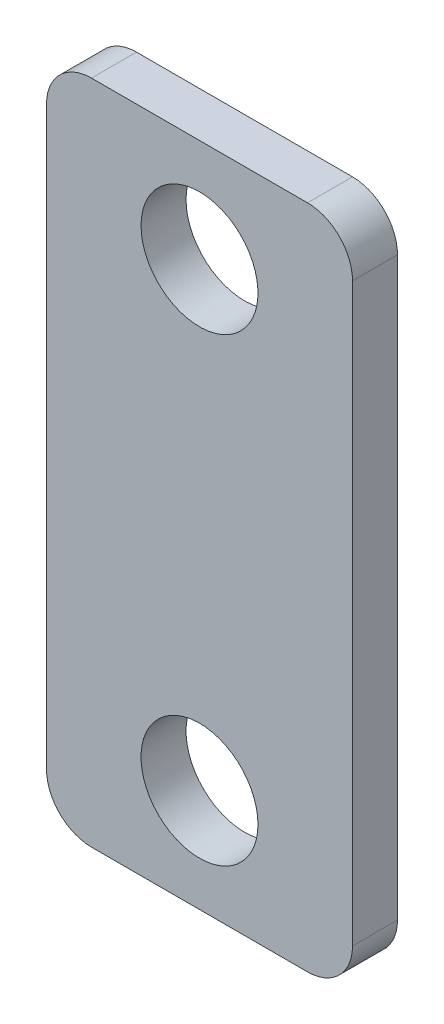
ISO-10303-21;
HEADER;
FILE_DESCRIPTION(('STEP AP214'),'2;1');
FILE_NAME('part.step','',(''),(''),'','','');
FILE_SCHEMA(('AUTOMOTIVE_DESIGN { 1 0 10303 214 1 1 1 1 }'));
ENDSEC;
DATA;
#1=APPLICATION_CONTEXT('core data for automotive mechanical design processes');
#2=APPLICATION_PROTOCOL_DEFINITION('international standard','automotive_design',2000,#1);
#3=PRODUCT_CONTEXT('',#1,'mechanical');
#4=PRODUCT('Part','Part','',(#3));
#5=PRODUCT_RELATED_PRODUCT_CATEGORY('part','',(#4));
#6=PRODUCT_DEFINITION_FORMATION('','',#4);
#7=PRODUCT_DEFINITION_CONTEXT('part definition',#1,'design');
#8=PRODUCT_DEFINITION('design','',#6,#7);
#9=PRODUCT_DEFINITION_SHAPE('','',#8);
#10=(LENGTH_UNIT() NAMED_UNIT(*) SI_UNIT(.MILLI.,.METRE.));
#11=(NAMED_UNIT(*) PLANE_ANGLE_UNIT() SI_UNIT($,.RADIAN.));
#12=(NAMED_UNIT(*) SI_UNIT($,.STERADIAN.) SOLID_ANGLE_UNIT());
#13=UNCERTAINTY_MEASURE_WITH_UNIT(LENGTH_MEASURE(1.E-05),#10,'distance_accuracy_value','');
#14=(GEOMETRIC_REPRESENTATION_CONTEXT(3) GLOBAL_UNCERTAINTY_ASSIGNED_CONTEXT((#13)) GLOBAL_UNIT_ASSIGNED_CONTEXT((#10,
#11,#12)) REPRESENTATION_CONTEXT('',''));
#15=CARTESIAN_POINT('',(0.,0.,0.));
#16=DIRECTION('',(0.,0.,1.));
#17=DIRECTION('',(1.,0.,0.));
#18=AXIS2_PLACEMENT_3D('',#15,#16,#17);
#19=CARTESIAN_POINT('',(0.,0.,3.175));
#20=DIRECTION('',(0.,0.,-1.));
#21=DIRECTION('',(-1.,0.,0.));
#22=AXIS2_PLACEMENT_3D('',#19,#20,#21);
#23=PLANE('',#22);
#24=CARTESIAN_POINT('',(10.795,39.7298015993552,3.175));
#25=DIRECTION('',(0.,0.,-1.));
#26=DIRECTION('',(-1.,0.,0.));
#27=AXIS2_PLACEMENT_3D('',#24,#25,#26);
#28=CIRCLE('',#27,4.124999878);
#29=CARTESIAN_POINT('',(6.670000122,39.7298015993552,3.175));
#30=VERTEX_POINT('',#29);
#31=EDGE_CURVE('E265',#30,#30,#28,.T.);
#32=ORIENTED_EDGE('',*,*,#31,.T.);
#33=EDGE_LOOP('',(#32));
#34=FACE_BOUND('',#33,.T.);
#35=DIRECTION('',(0.,1.,0.));
#36=VECTOR('',#35,1.);
#37=CARTESIAN_POINT('',(21.59,0.,3.175));
#38=LINE('',#37,#36);
#39=CARTESIAN_POINT('',(21.59,3.175,3.175));
#40=VERTEX_POINT('',#39);
#41=CARTESIAN_POINT('',(21.59,43.815,3.175));
#42=VERTEX_POINT('',#41);
#43=EDGE_CURVE('E170',#40,#42,#38,.T.);
#44=ORIENTED_EDGE('',*,*,#43,.T.);
#45=CARTESIAN_POINT('',(18.415,43.815,3.175));
#46=DIRECTION('',(0.,0.,-1.));
#47=DIRECTION('',(-1.,0.,0.));
#48=AXIS2_PLACEMENT_3D('',#45,#46,#47);
#49=CIRCLE('',#48,3.175);
#50=CARTESIAN_POINT('',(18.415,46.99,3.175));
#51=VERTEX_POINT('',#50);
#52=EDGE_CURVE('E188',#42,#51,#49,.F.);
#53=ORIENTED_EDGE('',*,*,#52,.T.);
#54=DIRECTION('',(1.,0.,0.));
#55=VECTOR('',#54,1.);
#56=CARTESIAN_POINT('',(0.,46.99,3.175));
#57=LINE('',#56,#55);
#58=CARTESIAN_POINT('',(3.175,46.99,3.175));
#59=VERTEX_POINT('',#58);
#60=EDGE_CURVE('E198',#59,#51,#57,.T.);
#61=ORIENTED_EDGE('',*,*,#60,.F.);
#62=CARTESIAN_POINT('',(3.175,43.815,3.175));
#63=DIRECTION('',(0.,0.,-1.));
#64=DIRECTION('',(-1.,0.,0.));
#65=AXIS2_PLACEMENT_3D('',#62,#63,#64);
#66=CIRCLE('',#65,3.175);
#67=CARTESIAN_POINT('',(0.,43.815,3.175));
#68=VERTEX_POINT('',#67);
#69=EDGE_CURVE('E165',#59,#68,#66,.F.);
#70=ORIENTED_EDGE('',*,*,#69,.T.);
#71=DIRECTION('',(0.,1.,0.));
#72=VECTOR('',#71,1.);
#73=CARTESIAN_POINT('',(0.,0.,3.175));
#74=LINE('',#73,#72);
#75=CARTESIAN_POINT('',(0.,3.175,3.175));
#76=VERTEX_POINT('',#75);
#77=EDGE_CURVE('E197',#76,#68,#74,.T.);
#78=ORIENTED_EDGE('',*,*,#77,.F.);
#79=CARTESIAN_POINT('',(3.175,3.175,3.175));
#80=DIRECTION('',(0.,0.,-1.));
#81=DIRECTION('',(-1.,0.,0.));
#82=AXIS2_PLACEMENT_3D('',#79,#80,#81);
#83=CIRCLE('',#82,3.175);
#84=CARTESIAN_POINT('',(3.175,0.,3.175));
#85=VERTEX_POINT('',#84);
#86=EDGE_CURVE('E94',#76,#85,#83,.F.);
#87=ORIENTED_EDGE('',*,*,#86,.T.);
#88=DIRECTION('',(1.,0.,0.));
#89=VECTOR('',#88,1.);
#90=CARTESIAN_POINT('',(0.,0.,3.175));
#91=LINE('',#90,#89);
#92=CARTESIAN_POINT('',(18.415,0.,3.175));
#93=VERTEX_POINT('',#92);
#94=EDGE_CURVE('E166',#85,#93,#91,.T.);
#95=ORIENTED_EDGE('',*,*,#94,.T.);
#96=CARTESIAN_POINT('',(18.415,3.175,3.175));
#97=DIRECTION('',(0.,0.,-1.));
#98=DIRECTION('',(-1.,0.,0.));
#99=AXIS2_PLACEMENT_3D('',#96,#97,#98);
#100=CIRCLE('',#99,3.175);
#101=EDGE_CURVE('E184',#93,#40,#100,.F.);
#102=ORIENTED_EDGE('',*,*,#101,.T.);
#103=EDGE_LOOP('',(#44,#53,#61,#70,#78,#87,#95,#102));
#104=FACE_BOUND('',#103,.T.);
#105=CARTESIAN_POINT('',(10.795,7.26019840064482,3.175));
#106=DIRECTION('',(0.,0.,1.));
#107=DIRECTION('',(1.,0.,0.));
#108=AXIS2_PLACEMENT_3D('',#105,#106,#107);
#109=CIRCLE('',#108,4.124999878);
#110=CARTESIAN_POINT('',(14.919999878,7.26019840064482,3.175));
#111=VERTEX_POINT('',#110);
#112=EDGE_CURVE('E207',#111,#111,#109,.T.);
#113=ORIENTED_EDGE('',*,*,#112,.F.);
#114=EDGE_LOOP('',(#113));
#115=FACE_BOUND('',#114,.T.);
#116=ADVANCED_FACE('F73',(#34,#104,#115),#23,.F.);
#117=CARTESIAN_POINT('',(0.,0.,0.));
#118=DIRECTION('',(0.,0.,-1.));
#119=DIRECTION('',(-1.,0.,0.));
#120=AXIS2_PLACEMENT_3D('',#117,#118,#119);
#121=PLANE('',#120);
#122=CARTESIAN_POINT('',(10.795,39.7298015993552,0.));
#123=DIRECTION('',(0.,0.,-1.));
#124=DIRECTION('',(-1.,0.,0.));
#125=AXIS2_PLACEMENT_3D('',#122,#123,#124);
#126=CIRCLE('',#125,4.124999878);
#127=CARTESIAN_POINT('',(6.670000122,39.7298015993552,0.));
#128=VERTEX_POINT('',#127);
#129=EDGE_CURVE('E268',#128,#128,#126,.T.);
#130=ORIENTED_EDGE('',*,*,#129,.F.);
#131=EDGE_LOOP('',(#130));
#132=FACE_BOUND('',#131,.T.);
#133=DIRECTION('',(1.,0.,0.));
#134=VECTOR('',#133,1.);
#135=CARTESIAN_POINT('',(0.,46.99,0.));
#136=LINE('',#135,#134);
#137=CARTESIAN_POINT('',(3.175,46.99,0.));
#138=VERTEX_POINT('',#137);
#139=CARTESIAN_POINT('',(18.415,46.99,0.));
#140=VERTEX_POINT('',#139);
#141=EDGE_CURVE('E143',#138,#140,#136,.T.);
#142=ORIENTED_EDGE('',*,*,#141,.T.);
#143=CARTESIAN_POINT('',(18.415,43.815,0.));
#144=DIRECTION('',(0.,0.,-1.));
#145=DIRECTION('',(-1.,0.,0.));
#146=AXIS2_PLACEMENT_3D('',#143,#144,#145);
#147=CIRCLE('',#146,3.175);
#148=CARTESIAN_POINT('',(21.59,43.815,0.));
#149=VERTEX_POINT('',#148);
#150=EDGE_CURVE('E150',#140,#149,#147,.T.);
#151=ORIENTED_EDGE('',*,*,#150,.T.);
#152=DIRECTION('',(0.,1.,0.));
#153=VECTOR('',#152,1.);
#154=CARTESIAN_POINT('',(21.59,0.,0.));
#155=LINE('',#154,#153);
#156=CARTESIAN_POINT('',(21.59,3.175,0.));
#157=VERTEX_POINT('',#156);
#158=EDGE_CURVE('E161',#157,#149,#155,.T.);
#159=ORIENTED_EDGE('',*,*,#158,.F.);
#160=CARTESIAN_POINT('',(18.415,3.175,0.));
#161=DIRECTION('',(0.,0.,-1.));
#162=DIRECTION('',(-1.,0.,0.));
#163=AXIS2_PLACEMENT_3D('',#160,#161,#162);
#164=CIRCLE('',#163,3.175);
#165=CARTESIAN_POINT('',(18.415,0.,0.));
#166=VERTEX_POINT('',#165);
#167=EDGE_CURVE('E168',#157,#166,#164,.T.);
#168=ORIENTED_EDGE('',*,*,#167,.T.);
#169=DIRECTION('',(1.,0.,0.));
#170=VECTOR('',#169,1.);
#171=CARTESIAN_POINT('',(0.,0.,0.));
#172=LINE('',#171,#170);
#173=CARTESIAN_POINT('',(3.175,0.,0.));
#174=VERTEX_POINT('',#173);
#175=EDGE_CURVE('E173',#174,#166,#172,.T.);
#176=ORIENTED_EDGE('',*,*,#175,.F.);
#177=CARTESIAN_POINT('',(3.175,3.175,0.));
#178=DIRECTION('',(0.,0.,-1.));
#179=DIRECTION('',(-1.,0.,0.));
#180=AXIS2_PLACEMENT_3D('',#177,#178,#179);
#181=CIRCLE('',#180,3.175);
#182=CARTESIAN_POINT('',(0.,3.175,0.));
#183=VERTEX_POINT('',#182);
#184=EDGE_CURVE('E151',#174,#183,#181,.T.);
#185=ORIENTED_EDGE('',*,*,#184,.T.);
#186=DIRECTION('',(0.,1.,0.));
#187=VECTOR('',#186,1.);
#188=CARTESIAN_POINT('',(0.,0.,0.));
#189=LINE('',#188,#187);
#190=CARTESIAN_POINT('',(0.,43.815,0.));
#191=VERTEX_POINT('',#190);
#192=EDGE_CURVE('E145',#183,#191,#189,.T.);
#193=ORIENTED_EDGE('',*,*,#192,.T.);
#194=CARTESIAN_POINT('',(3.175,43.815,0.));
#195=DIRECTION('',(0.,0.,-1.));
#196=DIRECTION('',(-1.,0.,0.));
#197=AXIS2_PLACEMENT_3D('',#194,#195,#196);
#198=CIRCLE('',#197,3.175);
#199=EDGE_CURVE('E139',#191,#138,#198,.T.);
#200=ORIENTED_EDGE('',*,*,#199,.T.);
#201=EDGE_LOOP('',(#142,#151,#159,#168,#176,#185,#193,#200));
#202=FACE_BOUND('',#201,.T.);
#203=CARTESIAN_POINT('',(10.795,7.26019840064482,0.));
#204=DIRECTION('',(0.,0.,1.));
#205=DIRECTION('',(1.,0.,0.));
#206=AXIS2_PLACEMENT_3D('',#203,#204,#205);
#207=CIRCLE('',#206,4.124999878);
#208=CARTESIAN_POINT('',(14.919999878,7.26019840064482,0.));
#209=VERTEX_POINT('',#208);
#210=EDGE_CURVE('E202',#209,#209,#207,.T.);
#211=ORIENTED_EDGE('',*,*,#210,.T.);
#212=EDGE_LOOP('',(#211));
#213=FACE_BOUND('',#212,.T.);
#214=ADVANCED_FACE('F141',(#132,#202,#213),#121,.T.);
#215=CARTESIAN_POINT('',(0.,0.,3.175));
#216=DIRECTION('',(-1.,0.,0.));
#217=DIRECTION('',(0.,0.,1.));
#218=AXIS2_PLACEMENT_3D('',#215,#216,#217);
#219=PLANE('',#218);
#220=ORIENTED_EDGE('',*,*,#77,.T.);
#221=DIRECTION('',(0.,0.,-1.));
#222=VECTOR('',#221,1.);
#223=CARTESIAN_POINT('',(0.,43.815,3.175));
#224=LINE('',#223,#222);
#225=EDGE_CURVE('E192',#68,#191,#224,.T.);
#226=ORIENTED_EDGE('',*,*,#225,.T.);
#227=ORIENTED_EDGE('',*,*,#192,.F.);
#228=DIRECTION('',(0.,0.,-1.));
#229=VECTOR('',#228,1.);
#230=CARTESIAN_POINT('',(0.,3.175,3.175));
#231=LINE('',#230,#229);
#232=EDGE_CURVE('E190',#183,#76,#231,.F.);
#233=ORIENTED_EDGE('',*,*,#232,.T.);
#234=EDGE_LOOP('',(#220,#226,#227,#233));
#235=FACE_BOUND('',#234,.T.);
#236=ADVANCED_FACE('F195',(#235),#219,.T.);
#237=CARTESIAN_POINT('',(0.,0.,3.175));
#238=DIRECTION('',(0.,1.,0.));
#239=DIRECTION('',(0.,0.,1.));
#240=AXIS2_PLACEMENT_3D('',#237,#238,#239);
#241=PLANE('',#240);
#242=ORIENTED_EDGE('',*,*,#94,.F.);
#243=DIRECTION('',(0.,0.,-1.));
#244=VECTOR('',#243,1.);
#245=CARTESIAN_POINT('',(3.175,0.,0.));
#246=LINE('',#245,#244);
#247=EDGE_CURVE('E12',#85,#174,#246,.T.);
#248=ORIENTED_EDGE('',*,*,#247,.T.);
#249=ORIENTED_EDGE('',*,*,#175,.T.);
#250=DIRECTION('',(0.,0.,-1.));
#251=VECTOR('',#250,1.);
#252=CARTESIAN_POINT('',(18.415,0.,3.175));
#253=LINE('',#252,#251);
#254=EDGE_CURVE('E81',#166,#93,#253,.F.);
#255=ORIENTED_EDGE('',*,*,#254,.T.);
#256=EDGE_LOOP('',(#242,#248,#249,#255));
#257=FACE_BOUND('',#256,.T.);
#258=ADVANCED_FACE('F222',(#257),#241,.F.);
#259=CARTESIAN_POINT('',(21.59,0.,3.175));
#260=DIRECTION('',(-1.,0.,0.));
#261=DIRECTION('',(0.,0.,1.));
#262=AXIS2_PLACEMENT_3D('',#259,#260,#261);
#263=PLANE('',#262);
#264=ORIENTED_EDGE('',*,*,#158,.T.);
#265=DIRECTION('',(0.,0.,-1.));
#266=VECTOR('',#265,1.);
#267=CARTESIAN_POINT('',(21.59,43.815,3.175));
#268=LINE('',#267,#266);
#269=EDGE_CURVE('E182',#149,#42,#268,.F.);
#270=ORIENTED_EDGE('',*,*,#269,.T.);
#271=ORIENTED_EDGE('',*,*,#43,.F.);
#272=DIRECTION('',(0.,0.,-1.));
#273=VECTOR('',#272,1.);
#274=CARTESIAN_POINT('',(21.59,3.175,3.175));
#275=LINE('',#274,#273);
#276=EDGE_CURVE('E179',#40,#157,#275,.T.);
#277=ORIENTED_EDGE('',*,*,#276,.T.);
#278=EDGE_LOOP('',(#264,#270,#271,#277));
#279=FACE_BOUND('',#278,.T.);
#280=ADVANCED_FACE('F212',(#279),#263,.F.);
#281=CARTESIAN_POINT('',(0.,46.99,3.175));
#282=DIRECTION('',(0.,1.,0.));
#283=DIRECTION('',(0.,0.,1.));
#284=AXIS2_PLACEMENT_3D('',#281,#282,#283);
#285=PLANE('',#284);
#286=ORIENTED_EDGE('',*,*,#60,.T.);
#287=DIRECTION('',(0.,0.,-1.));
#288=VECTOR('',#287,1.);
#289=CARTESIAN_POINT('',(18.415,46.99,0.));
#290=LINE('',#289,#288);
#291=EDGE_CURVE('E160',#51,#140,#290,.T.);
#292=ORIENTED_EDGE('',*,*,#291,.T.);
#293=ORIENTED_EDGE('',*,*,#141,.F.);
#294=DIRECTION('',(0.,0.,-1.));
#295=VECTOR('',#294,1.);
#296=CARTESIAN_POINT('',(3.175,46.99,3.175));
#297=LINE('',#296,#295);
#298=EDGE_CURVE('E157',#138,#59,#297,.F.);
#299=ORIENTED_EDGE('',*,*,#298,.T.);
#300=EDGE_LOOP('',(#286,#292,#293,#299));
#301=FACE_BOUND('',#300,.T.);
#302=ADVANCED_FACE('F156',(#301),#285,.T.);
#303=CARTESIAN_POINT('',(10.795,7.26019840064482,3.175));
#304=DIRECTION('',(0.,0.,-1.));
#305=DIRECTION('',(-1.,0.,0.));
#306=AXIS2_PLACEMENT_3D('',#303,#304,#305);
#307=CYLINDRICAL_SURFACE('',#306,4.124999878);
#308=ORIENTED_EDGE('',*,*,#112,.T.);
#309=EDGE_LOOP('',(#308));
#310=FACE_BOUND('',#309,.T.);
#311=ORIENTED_EDGE('',*,*,#210,.F.);
#312=EDGE_LOOP('',(#311));
#313=FACE_BOUND('',#312,.T.);
#314=ADVANCED_FACE('F243',(#310,#313),#307,.F.);
#315=CARTESIAN_POINT('',(10.795,39.7298015993552,3.175));
#316=DIRECTION('',(0.,0.,-1.));
#317=DIRECTION('',(-1.,0.,0.));
#318=AXIS2_PLACEMENT_3D('',#315,#316,#317);
#319=CYLINDRICAL_SURFACE('',#318,4.124999878);
#320=ORIENTED_EDGE('',*,*,#31,.F.);
#321=EDGE_LOOP('',(#320));
#322=FACE_BOUND('',#321,.T.);
#323=ORIENTED_EDGE('',*,*,#129,.T.);
#324=EDGE_LOOP('',(#323));
#325=FACE_BOUND('',#324,.T.);
#326=ADVANCED_FACE('F255',(#322,#325),#319,.F.);
#327=CARTESIAN_POINT('',(18.415,43.815,3.175));
#328=DIRECTION('',(0.,0.,1.));
#329=DIRECTION('',(1.,0.,0.));
#330=AXIS2_PLACEMENT_3D('',#327,#328,#329);
#331=CYLINDRICAL_SURFACE('',#330,3.175);
#332=ORIENTED_EDGE('',*,*,#52,.F.);
#333=ORIENTED_EDGE('',*,*,#269,.F.);
#334=ORIENTED_EDGE('',*,*,#150,.F.);
#335=ORIENTED_EDGE('',*,*,#291,.F.);
#336=EDGE_LOOP('',(#332,#333,#334,#335));
#337=FACE_BOUND('',#336,.T.);
#338=ADVANCED_FACE('F217',(#337),#331,.T.);
#339=CARTESIAN_POINT('',(3.175,43.815,3.175));
#340=DIRECTION('',(0.,0.,-1.));
#341=DIRECTION('',(-1.,0.,0.));
#342=AXIS2_PLACEMENT_3D('',#339,#340,#341);
#343=CYLINDRICAL_SURFACE('',#342,3.175);
#344=ORIENTED_EDGE('',*,*,#69,.F.);
#345=ORIENTED_EDGE('',*,*,#298,.F.);
#346=ORIENTED_EDGE('',*,*,#199,.F.);
#347=ORIENTED_EDGE('',*,*,#225,.F.);
#348=EDGE_LOOP('',(#344,#345,#346,#347));
#349=FACE_BOUND('',#348,.T.);
#350=ADVANCED_FACE('F164',(#349),#343,.T.);
#351=CARTESIAN_POINT('',(3.175,3.175,3.175));
#352=DIRECTION('',(0.,0.,1.));
#353=DIRECTION('',(1.,0.,0.));
#354=AXIS2_PLACEMENT_3D('',#351,#352,#353);
#355=CYLINDRICAL_SURFACE('',#354,3.175);
#356=ORIENTED_EDGE('',*,*,#86,.F.);
#357=ORIENTED_EDGE('',*,*,#232,.F.);
#358=ORIENTED_EDGE('',*,*,#184,.F.);
#359=ORIENTED_EDGE('',*,*,#247,.F.);
#360=EDGE_LOOP('',(#356,#357,#358,#359));
#361=FACE_BOUND('',#360,.T.);
#362=ADVANCED_FACE('F225',(#361),#355,.T.);
#363=CARTESIAN_POINT('',(18.415,3.175,3.175));
#364=DIRECTION('',(0.,0.,-1.));
#365=DIRECTION('',(-1.,0.,0.));
#366=AXIS2_PLACEMENT_3D('',#363,#364,#365);
#367=CYLINDRICAL_SURFACE('',#366,3.175);
#368=ORIENTED_EDGE('',*,*,#101,.F.);
#369=ORIENTED_EDGE('',*,*,#254,.F.);
#370=ORIENTED_EDGE('',*,*,#167,.F.);
#371=ORIENTED_EDGE('',*,*,#276,.F.);
#372=EDGE_LOOP('',(#368,#369,#370,#371));
#373=FACE_BOUND('',#372,.T.);
#374=ADVANCED_FACE('F75',(#373),#367,.T.);
#375=CLOSED_SHELL('',(#116,#214,#236,#258,#280,#302,#314,#326,#338,#350,#362,#374));
#376=MANIFOLD_SOLID_BREP('B2',#375);
#377=ADVANCED_BREP_SHAPE_REPRESENTATION('',(#18,#376),#14);
#378=SHAPE_DEFINITION_REPRESENTATION(#9,#377);
ENDSEC;
END-ISO-10303-21;
